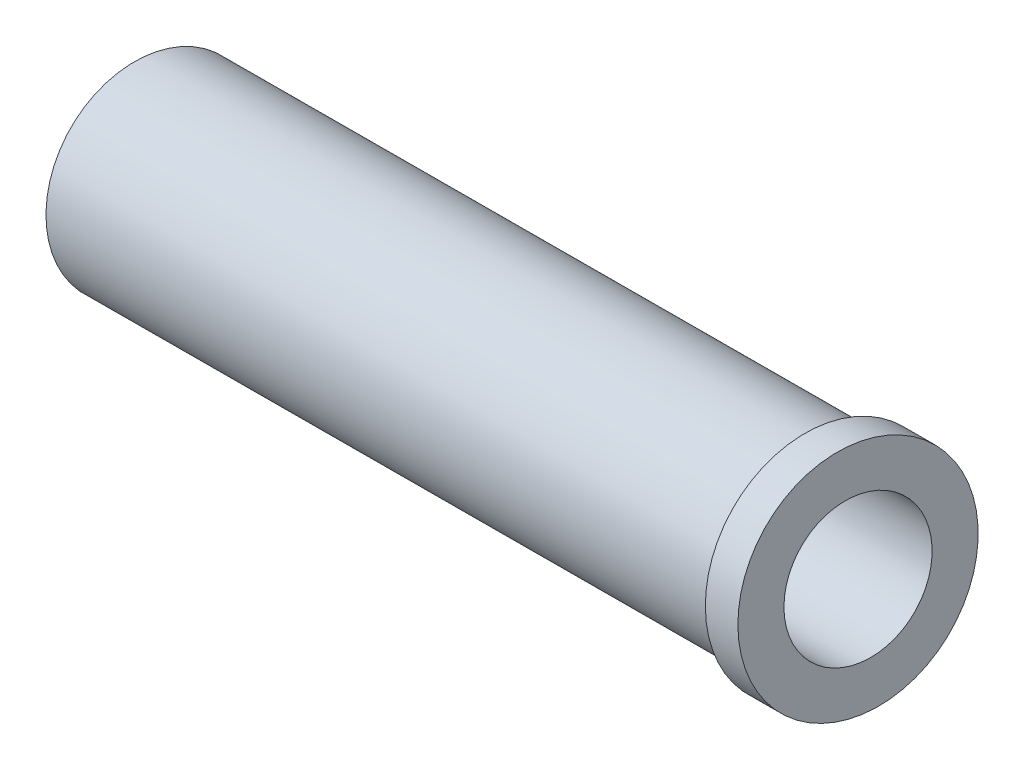
ISO-10303-21;
HEADER;
FILE_DESCRIPTION(('STEP AP214'),'2;1');
FILE_NAME('part.step','',(''),(''),'','','');
FILE_SCHEMA(('AUTOMOTIVE_DESIGN { 1 0 10303 214 1 1 1 1 }'));
ENDSEC;
DATA;
#1=APPLICATION_CONTEXT('core data for automotive mechanical design processes');
#2=APPLICATION_PROTOCOL_DEFINITION('international standard','automotive_design',2000,#1);
#3=PRODUCT_CONTEXT('',#1,'mechanical');
#4=PRODUCT('Part','Part','',(#3));
#5=PRODUCT_RELATED_PRODUCT_CATEGORY('part','',(#4));
#6=PRODUCT_DEFINITION_FORMATION('','',#4);
#7=PRODUCT_DEFINITION_CONTEXT('part definition',#1,'design');
#8=PRODUCT_DEFINITION('design','',#6,#7);
#9=PRODUCT_DEFINITION_SHAPE('','',#8);
#10=(LENGTH_UNIT() NAMED_UNIT(*) SI_UNIT(.MILLI.,.METRE.));
#11=(NAMED_UNIT(*) PLANE_ANGLE_UNIT() SI_UNIT($,.RADIAN.));
#12=(NAMED_UNIT(*) SI_UNIT($,.STERADIAN.) SOLID_ANGLE_UNIT());
#13=UNCERTAINTY_MEASURE_WITH_UNIT(LENGTH_MEASURE(1.E-05),#10,'distance_accuracy_value','');
#14=(GEOMETRIC_REPRESENTATION_CONTEXT(3) GLOBAL_UNCERTAINTY_ASSIGNED_CONTEXT((#13)) GLOBAL_UNIT_ASSIGNED_CONTEXT((#10,
#11,#12)) REPRESENTATION_CONTEXT('',''));
#15=CARTESIAN_POINT('',(0.,0.,0.));
#16=DIRECTION('',(0.,0.,1.));
#17=DIRECTION('',(1.,0.,0.));
#18=AXIS2_PLACEMENT_3D('',#15,#16,#17);
#19=CARTESIAN_POINT('',(-379.480094056702,26.7979904043163,-39.1960093106634));
#20=DIRECTION('',(-0.990047028350796,-0.101004797841849,-0.0980046553316952));
#21=DIRECTION('',(-0.101493391467891,0.994836213398138,0.));
#22=AXIS2_PLACEMENT_3D('',#19,#20,#21);
#23=PLANE('',#22);
#24=CARTESIAN_POINT('',(-379.480094056702,26.7979904043163,-39.1960093106634));
#25=DIRECTION('',(0.990047028350796,0.101004797841849,0.0980046553316952));
#26=DIRECTION('',(-0.101493391467891,0.994836213398138,0.));
#27=AXIS2_PLACEMENT_3D('',#24,#25,#26);
#28=CIRCLE('',#27,16.);
#29=CARTESIAN_POINT('',(-381.103988320188,42.7153698186865,-39.1960093106634));
#30=VERTEX_POINT('',#29);
#31=EDGE_CURVE('E57',#30,#30,#28,.T.);
#32=ORIENTED_EDGE('',*,*,#31,.F.);
#33=EDGE_LOOP('',(#32));
#34=FACE_BOUND('',#33,.T.);
#35=ADVANCED_FACE('F49',(#34),#23,.T.);
#36=CARTESIAN_POINT('',(-250.773980371098,39.9286141237567,-26.455404117543));
#37=DIRECTION('',(-0.990047028350796,-0.101004797841849,-0.0980046553316951));
#38=DIRECTION('',(-0.101493391467891,0.994836213398138,0.));
#39=AXIS2_PLACEMENT_3D('',#36,#37,#38);
#40=CYLINDRICAL_SURFACE('',#39,16.);
#41=CARTESIAN_POINT('',(-256.714262541203,39.3225853367056,-27.0434320495332));
#42=DIRECTION('',(0.990047028350796,0.101004797841851,0.0980046553316965));
#43=DIRECTION('',(-0.101493391467893,0.994836213398138,0.));
#44=AXIS2_PLACEMENT_3D('',#41,#42,#43);
#45=CIRCLE('',#44,16.);
#46=CARTESIAN_POINT('',(-258.338156804689,55.2399647510758,-27.0434320495332));
#47=VERTEX_POINT('',#46);
#48=EDGE_CURVE('E11',#47,#47,#45,.F.);
#49=ORIENTED_EDGE('',*,*,#48,.T.);
#50=EDGE_LOOP('',(#49));
#51=FACE_BOUND('',#50,.T.);
#52=ORIENTED_EDGE('',*,*,#31,.T.);
#53=EDGE_LOOP('',(#52));
#54=FACE_BOUND('',#53,.T.);
#55=ADVANCED_FACE('F90',(#51,#54),#40,.T.);
#56=CARTESIAN_POINT('',(-256.714262541203,39.3225853367056,-27.0434320495332));
#57=DIRECTION('',(-0.990047028350796,-0.101004797841851,-0.0980046553316965));
#58=DIRECTION('',(-0.101493391467893,0.994836213398138,0.));
#59=AXIS2_PLACEMENT_3D('',#56,#57,#58);
#60=PLANE('',#59);
#61=ORIENTED_EDGE('',*,*,#48,.F.);
#62=EDGE_LOOP('',(#61));
#63=FACE_BOUND('',#62,.T.);
#64=CARTESIAN_POINT('',(-256.714262541203,39.3225853367056,-27.0434320495332));
#65=DIRECTION('',(0.990047028350796,0.101004797841851,0.0980046553316965));
#66=DIRECTION('',(-0.101493391467893,0.994836213398138,0.));
#67=AXIS2_PLACEMENT_3D('',#64,#65,#66);
#68=CIRCLE('',#67,18.);
#69=CARTESIAN_POINT('',(-258.541143587625,57.229637177872,-27.0434320495332));
#70=VERTEX_POINT('',#69);
#71=EDGE_CURVE('E61',#70,#70,#68,.T.);
#72=ORIENTED_EDGE('',*,*,#71,.F.);
#73=EDGE_LOOP('',(#72));
#74=FACE_BOUND('',#73,.T.);
#75=ADVANCED_FACE('F84',(#63,#74),#60,.T.);
#76=CARTESIAN_POINT('',(-250.773980371098,39.9286141237567,-26.455404117543));
#77=DIRECTION('',(-0.990047028350796,-0.101004797841849,-0.098004655331695));
#78=DIRECTION('',(-0.101493391467891,0.994836213398138,0.));
#79=AXIS2_PLACEMENT_3D('',#76,#77,#78);
#80=CYLINDRICAL_SURFACE('',#79,18.);
#81=ORIENTED_EDGE('',*,*,#71,.T.);
#82=EDGE_LOOP('',(#81));
#83=FACE_BOUND('',#82,.T.);
#84=CARTESIAN_POINT('',(-250.773980371098,39.9286141237567,-26.455404117543));
#85=DIRECTION('',(0.990047028350796,0.101004797841851,0.0980046553316965));
#86=DIRECTION('',(-0.101493391467893,0.994836213398138,0.));
#87=AXIS2_PLACEMENT_3D('',#84,#85,#86);
#88=CIRCLE('',#87,18.);
#89=CARTESIAN_POINT('',(-252.60086141752,57.8356659649231,-26.455404117543));
#90=VERTEX_POINT('',#89);
#91=EDGE_CURVE('E66',#90,#90,#88,.T.);
#92=ORIENTED_EDGE('',*,*,#91,.F.);
#93=EDGE_LOOP('',(#92));
#94=FACE_BOUND('',#93,.T.);
#95=ADVANCED_FACE('F80',(#83,#94),#80,.T.);
#96=CARTESIAN_POINT('',(-250.773980371098,39.9286141237567,-26.455404117543));
#97=DIRECTION('',(-0.990047028350796,-0.101004797841849,-0.0980046553316952));
#98=DIRECTION('',(-0.101493391467891,0.994836213398138,0.));
#99=AXIS2_PLACEMENT_3D('',#96,#97,#98);
#100=PLANE('',#99);
#101=CARTESIAN_POINT('',(-250.773980371098,39.9286141237567,-26.455404117543));
#102=DIRECTION('',(0.990047028350796,0.101004797841849,0.0980046553316952));
#103=DIRECTION('',(-0.101493391467891,0.994836213398138,0.));
#104=AXIS2_PLACEMENT_3D('',#101,#102,#103);
#105=CIRCLE('',#104,11.1);
#106=CARTESIAN_POINT('',(-251.900557016392,50.971296092476,-26.455404117543));
#107=VERTEX_POINT('',#106);
#108=EDGE_CURVE('E53',#107,#107,#105,.T.);
#109=ORIENTED_EDGE('',*,*,#108,.F.);
#110=EDGE_LOOP('',(#109));
#111=FACE_BOUND('',#110,.T.);
#112=ORIENTED_EDGE('',*,*,#91,.T.);
#113=EDGE_LOOP('',(#112));
#114=FACE_BOUND('',#113,.T.);
#115=ADVANCED_FACE('F51',(#111,#114),#100,.F.);
#116=CARTESIAN_POINT('',(-249.783933342747,40.0296189215985,-26.3573994622113));
#117=DIRECTION('',(-0.990047028350797,-0.101004797841849,-0.098004655331695));
#118=DIRECTION('',(-0.101493391467891,0.994836213398138,0.));
#119=AXIS2_PLACEMENT_3D('',#116,#117,#118);
#120=CYLINDRICAL_SURFACE('',#119,11.1);
#121=CARTESIAN_POINT('',(-377.5,27.,-39.));
#122=DIRECTION('',(0.990047028350796,0.101004797841849,0.098004655331695));
#123=DIRECTION('',(-0.101493391467891,0.994836213398138,0.));
#124=AXIS2_PLACEMENT_3D('',#121,#122,#123);
#125=CIRCLE('',#124,11.1);
#126=CARTESIAN_POINT('',(-378.626576645294,38.0426819687193,-39.));
#127=VERTEX_POINT('',#126);
#128=EDGE_CURVE('E69',#127,#127,#125,.T.);
#129=ORIENTED_EDGE('',*,*,#128,.F.);
#130=EDGE_LOOP('',(#129));
#131=FACE_BOUND('',#130,.T.);
#132=ORIENTED_EDGE('',*,*,#108,.T.);
#133=EDGE_LOOP('',(#132));
#134=FACE_BOUND('',#133,.T.);
#135=ADVANCED_FACE('F76',(#131,#134),#120,.F.);
#136=CARTESIAN_POINT('',(-377.5,27.,-39.));
#137=DIRECTION('',(-0.990047028350796,-0.101004797841849,-0.098004655331695));
#138=DIRECTION('',(-0.101493391467891,0.994836213398138,0.));
#139=AXIS2_PLACEMENT_3D('',#136,#137,#138);
#140=PLANE('',#139);
#141=ORIENTED_EDGE('',*,*,#128,.T.);
#142=EDGE_LOOP('',(#141));
#143=FACE_BOUND('',#142,.T.);
#144=ADVANCED_FACE('F128',(#143),#140,.F.);
#145=CLOSED_SHELL('',(#35,#55,#75,#95,#115,#135,#144));
#146=MANIFOLD_SOLID_BREP('B2',#145);
#147=ADVANCED_BREP_SHAPE_REPRESENTATION('',(#18,#146),#14);
#148=SHAPE_DEFINITION_REPRESENTATION(#9,#147);
ENDSEC;
END-ISO-10303-21;
